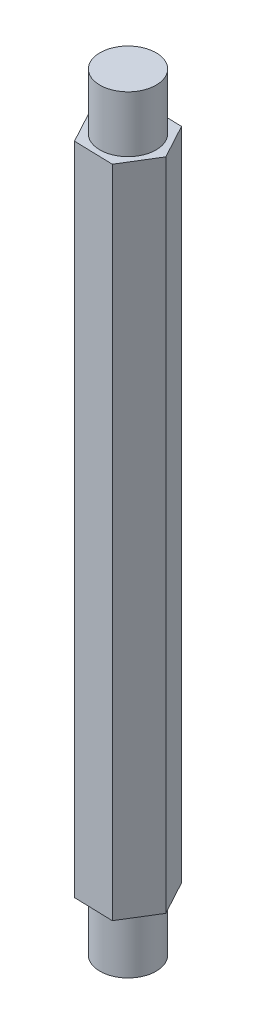
ISO-10303-21;
HEADER;
FILE_DESCRIPTION(('STEP AP214'),'2;1');
FILE_NAME('part.step','',(''),(''),'','','');
FILE_SCHEMA(('AUTOMOTIVE_DESIGN { 1 0 10303 214 1 1 1 1 }'));
ENDSEC;
DATA;
#1=APPLICATION_CONTEXT('core data for automotive mechanical design processes');
#2=APPLICATION_PROTOCOL_DEFINITION('international standard','automotive_design',2000,#1);
#3=PRODUCT_CONTEXT('',#1,'mechanical');
#4=PRODUCT('Part','Part','',(#3));
#5=PRODUCT_RELATED_PRODUCT_CATEGORY('part','',(#4));
#6=PRODUCT_DEFINITION_FORMATION('','',#4);
#7=PRODUCT_DEFINITION_CONTEXT('part definition',#1,'design');
#8=PRODUCT_DEFINITION('design','',#6,#7);
#9=PRODUCT_DEFINITION_SHAPE('','',#8);
#10=(LENGTH_UNIT() NAMED_UNIT(*) SI_UNIT(.MILLI.,.METRE.));
#11=(NAMED_UNIT(*) PLANE_ANGLE_UNIT() SI_UNIT($,.RADIAN.));
#12=(NAMED_UNIT(*) SI_UNIT($,.STERADIAN.) SOLID_ANGLE_UNIT());
#13=UNCERTAINTY_MEASURE_WITH_UNIT(LENGTH_MEASURE(1.E-05),#10,'distance_accuracy_value','');
#14=(GEOMETRIC_REPRESENTATION_CONTEXT(3) GLOBAL_UNCERTAINTY_ASSIGNED_CONTEXT((#13)) GLOBAL_UNIT_ASSIGNED_CONTEXT((#10,
#11,#12)) REPRESENTATION_CONTEXT('',''));
#15=CARTESIAN_POINT('',(0.,0.,0.));
#16=DIRECTION('',(0.,0.,1.));
#17=DIRECTION('',(1.,0.,0.));
#18=AXIS2_PLACEMENT_3D('',#15,#16,#17);
#19=CARTESIAN_POINT('',(0.,38.,0.));
#20=DIRECTION('',(0.,1.,0.));
#21=DIRECTION('',(0.,0.,1.));
#22=AXIS2_PLACEMENT_3D('',#19,#20,#21);
#23=PLANE('',#22);
#24=DIRECTION('',(-0.999619051100166,0.,-0.0275998673475779));
#25=VECTOR('',#24,1.);
#26=CARTESIAN_POINT('',(1.08851435205721,38.,-1.7706316684634));
#27=LINE('',#26,#25);
#28=CARTESIAN_POINT('',(1.08851435205721,38.,-1.7706316684634));
#29=VERTEX_POINT('',#28);
#30=CARTESIAN_POINT('',(-0.989154829605925,38.,-1.8279969154972));
#31=VERTEX_POINT('',#30);
#32=EDGE_CURVE('E132',#29,#31,#27,.T.);
#33=ORIENTED_EDGE('',*,*,#32,.T.);
#34=DIRECTION('',(-0.523711711814166,0.,0.85189555868585));
#35=VECTOR('',#34,1.);
#36=CARTESIAN_POINT('',(-0.989154829605925,38.,-1.8279969154972));
#37=LINE('',#36,#35);
#38=CARTESIAN_POINT('',(-2.07766918166313,38.,-0.0573652470337996));
#39=VERTEX_POINT('',#38);
#40=EDGE_CURVE('E90',#31,#39,#37,.T.);
#41=ORIENTED_EDGE('',*,*,#40,.T.);
#42=DIRECTION('',(0.475907339286,0.,0.879495426033427));
#43=VECTOR('',#42,1.);
#44=CARTESIAN_POINT('',(-2.07766918166313,38.,-0.0573652470337996));
#45=LINE('',#44,#43);
#46=CARTESIAN_POINT('',(-1.0885143520572,38.,1.7706316684634));
#47=VERTEX_POINT('',#46);
#48=EDGE_CURVE('E103',#39,#47,#45,.T.);
#49=ORIENTED_EDGE('',*,*,#48,.T.);
#50=DIRECTION('',(0.999619051100166,0.,0.0275998673475778));
#51=VECTOR('',#50,1.);
#52=CARTESIAN_POINT('',(-1.0885143520572,38.,1.7706316684634));
#53=LINE('',#52,#51);
#54=CARTESIAN_POINT('',(0.989154829605927,38.,1.8279969154972));
#55=VERTEX_POINT('',#54);
#56=EDGE_CURVE('E97',#47,#55,#53,.T.);
#57=ORIENTED_EDGE('',*,*,#56,.T.);
#58=DIRECTION('',(0.523711711814166,0.,-0.85189555868585));
#59=VECTOR('',#58,1.);
#60=CARTESIAN_POINT('',(0.989154829605927,38.,1.8279969154972));
#61=LINE('',#60,#59);
#62=CARTESIAN_POINT('',(2.07766918166313,38.,0.0573652470337994));
#63=VERTEX_POINT('',#62);
#64=EDGE_CURVE('E101',#55,#63,#61,.T.);
#65=ORIENTED_EDGE('',*,*,#64,.T.);
#66=DIRECTION('',(-0.475907339286,0.,-0.879495426033427));
#67=VECTOR('',#66,1.);
#68=CARTESIAN_POINT('',(2.07766918166313,38.,0.0573652470337994));
#69=LINE('',#68,#67);
#70=EDGE_CURVE('E52',#63,#29,#69,.T.);
#71=ORIENTED_EDGE('',*,*,#70,.T.);
#72=EDGE_LOOP('',(#33,#41,#49,#57,#65,#71));
#73=FACE_BOUND('',#72,.T.);
#74=CARTESIAN_POINT('',(0.,38.,0.));
#75=DIRECTION('',(0.,1.,0.));
#76=DIRECTION('',(0.,0.,1.));
#77=AXIS2_PLACEMENT_3D('',#74,#75,#76);
#78=CIRCLE('',#77,1.5);
#79=CARTESIAN_POINT('',(0.,38.,1.5));
#80=VERTEX_POINT('',#79);
#81=EDGE_CURVE('E189',#80,#80,#78,.T.);
#82=ORIENTED_EDGE('',*,*,#81,.F.);
#83=EDGE_LOOP('',(#82));
#84=FACE_BOUND('',#83,.T.);
#85=ADVANCED_FACE('F35',(#73,#84),#23,.T.);
#86=CARTESIAN_POINT('',(0.,3.,0.));
#87=DIRECTION('',(0.,-1.,0.));
#88=DIRECTION('',(0.,0.,-1.));
#89=AXIS2_PLACEMENT_3D('',#86,#87,#88);
#90=CYLINDRICAL_SURFACE('',#89,1.5);
#91=CARTESIAN_POINT('',(0.,3.,0.));
#92=DIRECTION('',(0.,1.,0.));
#93=DIRECTION('',(0.,0.,1.));
#94=AXIS2_PLACEMENT_3D('',#91,#92,#93);
#95=CIRCLE('',#94,1.5);
#96=CARTESIAN_POINT('',(0.,3.,1.5));
#97=VERTEX_POINT('',#96);
#98=EDGE_CURVE('E11',#97,#97,#95,.T.);
#99=ORIENTED_EDGE('',*,*,#98,.F.);
#100=EDGE_LOOP('',(#99));
#101=FACE_BOUND('',#100,.T.);
#102=CARTESIAN_POINT('',(0.,0.,0.));
#103=DIRECTION('',(0.,1.,0.));
#104=DIRECTION('',(0.,0.,1.));
#105=AXIS2_PLACEMENT_3D('',#102,#103,#104);
#106=CIRCLE('',#105,1.5);
#107=CARTESIAN_POINT('',(0.,0.,1.5));
#108=VERTEX_POINT('',#107);
#109=EDGE_CURVE('E39',#108,#108,#106,.T.);
#110=ORIENTED_EDGE('',*,*,#109,.T.);
#111=EDGE_LOOP('',(#110));
#112=FACE_BOUND('',#111,.T.);
#113=ADVANCED_FACE('F37',(#101,#112),#90,.T.);
#114=CARTESIAN_POINT('',(0.,0.,0.));
#115=DIRECTION('',(0.,1.,0.));
#116=DIRECTION('',(0.,0.,1.));
#117=AXIS2_PLACEMENT_3D('',#114,#115,#116);
#118=PLANE('',#117);
#119=ORIENTED_EDGE('',*,*,#109,.F.);
#120=EDGE_LOOP('',(#119));
#121=FACE_BOUND('',#120,.T.);
#122=ADVANCED_FACE('F145',(#121),#118,.F.);
#123=CARTESIAN_POINT('',(0.,3.,0.));
#124=DIRECTION('',(0.,1.,0.));
#125=DIRECTION('',(0.,0.,1.));
#126=AXIS2_PLACEMENT_3D('',#123,#124,#125);
#127=PLANE('',#126);
#128=DIRECTION('',(-0.999619051100166,0.,-0.0275998673475779));
#129=VECTOR('',#128,1.);
#130=CARTESIAN_POINT('',(1.08851435205721,3.,-1.7706316684634));
#131=LINE('',#130,#129);
#132=CARTESIAN_POINT('',(1.08851435205721,3.,-1.7706316684634));
#133=VERTEX_POINT('',#132);
#134=CARTESIAN_POINT('',(-0.989154829605925,3.,-1.8279969154972));
#135=VERTEX_POINT('',#134);
#136=EDGE_CURVE('E121',#133,#135,#131,.T.);
#137=ORIENTED_EDGE('',*,*,#136,.F.);
#138=DIRECTION('',(-0.475907339286,0.,-0.879495426033427));
#139=VECTOR('',#138,1.);
#140=CARTESIAN_POINT('',(2.07766918166313,3.,0.0573652470337994));
#141=LINE('',#140,#139);
#142=CARTESIAN_POINT('',(2.07766918166313,3.,0.0573652470337994));
#143=VERTEX_POINT('',#142);
#144=EDGE_CURVE('E81',#143,#133,#141,.T.);
#145=ORIENTED_EDGE('',*,*,#144,.F.);
#146=DIRECTION('',(0.523711711814166,0.,-0.85189555868585));
#147=VECTOR('',#146,1.);
#148=CARTESIAN_POINT('',(0.989154829605927,3.,1.8279969154972));
#149=LINE('',#148,#147);
#150=CARTESIAN_POINT('',(0.989154829605927,3.,1.8279969154972));
#151=VERTEX_POINT('',#150);
#152=EDGE_CURVE('E75',#151,#143,#149,.T.);
#153=ORIENTED_EDGE('',*,*,#152,.F.);
#154=DIRECTION('',(0.999619051100166,0.,0.0275998673475778));
#155=VECTOR('',#154,1.);
#156=CARTESIAN_POINT('',(-1.0885143520572,3.,1.7706316684634));
#157=LINE('',#156,#155);
#158=CARTESIAN_POINT('',(-1.0885143520572,3.,1.7706316684634));
#159=VERTEX_POINT('',#158);
#160=EDGE_CURVE('E111',#159,#151,#157,.T.);
#161=ORIENTED_EDGE('',*,*,#160,.F.);
#162=DIRECTION('',(0.475907339286,0.,0.879495426033427));
#163=VECTOR('',#162,1.);
#164=CARTESIAN_POINT('',(-2.07766918166313,3.,-0.0573652470337996));
#165=LINE('',#164,#163);
#166=CARTESIAN_POINT('',(-2.07766918166313,3.,-0.0573652470337996));
#167=VERTEX_POINT('',#166);
#168=EDGE_CURVE('E127',#167,#159,#165,.T.);
#169=ORIENTED_EDGE('',*,*,#168,.F.);
#170=DIRECTION('',(-0.523711711814166,0.,0.85189555868585));
#171=VECTOR('',#170,1.);
#172=CARTESIAN_POINT('',(-0.989154829605925,3.,-1.8279969154972));
#173=LINE('',#172,#171);
#174=EDGE_CURVE('E124',#135,#167,#173,.T.);
#175=ORIENTED_EDGE('',*,*,#174,.F.);
#176=EDGE_LOOP('',(#137,#145,#153,#161,#169,#175));
#177=FACE_BOUND('',#176,.T.);
#178=ORIENTED_EDGE('',*,*,#98,.T.);
#179=EDGE_LOOP('',(#178));
#180=FACE_BOUND('',#179,.T.);
#181=ADVANCED_FACE('F147',(#177,#180),#127,.F.);
#182=CARTESIAN_POINT('',(1.08851435205721,38.,-1.7706316684634));
#183=DIRECTION('',(-0.0275998673475779,0.,0.999619051100166));
#184=DIRECTION('',(0.999619051100166,0.,0.0275998673475779));
#185=AXIS2_PLACEMENT_3D('',#182,#183,#184);
#186=PLANE('',#185);
#187=ORIENTED_EDGE('',*,*,#136,.T.);
#188=DIRECTION('',(0.,-1.,0.));
#189=VECTOR('',#188,1.);
#190=CARTESIAN_POINT('',(-0.989154829605925,38.,-1.8279969154972));
#191=LINE('',#190,#189);
#192=EDGE_CURVE('E139',#31,#135,#191,.T.);
#193=ORIENTED_EDGE('',*,*,#192,.F.);
#194=ORIENTED_EDGE('',*,*,#32,.F.);
#195=DIRECTION('',(0.,-1.,0.));
#196=VECTOR('',#195,1.);
#197=CARTESIAN_POINT('',(1.08851435205721,38.,-1.7706316684634));
#198=LINE('',#197,#196);
#199=EDGE_CURVE('E117',#29,#133,#198,.T.);
#200=ORIENTED_EDGE('',*,*,#199,.T.);
#201=EDGE_LOOP('',(#187,#193,#194,#200));
#202=FACE_BOUND('',#201,.T.);
#203=ADVANCED_FACE('F152',(#202),#186,.F.);
#204=CARTESIAN_POINT('',(-0.989154829605925,38.,-1.8279969154972));
#205=DIRECTION('',(0.85189555868585,0.,0.523711711814166));
#206=DIRECTION('',(0.523711711814166,0.,-0.85189555868585));
#207=AXIS2_PLACEMENT_3D('',#204,#205,#206);
#208=PLANE('',#207);
#209=ORIENTED_EDGE('',*,*,#174,.T.);
#210=DIRECTION('',(0.,-1.,0.));
#211=VECTOR('',#210,1.);
#212=CARTESIAN_POINT('',(-2.07766918166313,38.,-0.0573652470337996));
#213=LINE('',#212,#211);
#214=EDGE_CURVE('E136',#39,#167,#213,.T.);
#215=ORIENTED_EDGE('',*,*,#214,.F.);
#216=ORIENTED_EDGE('',*,*,#40,.F.);
#217=ORIENTED_EDGE('',*,*,#192,.T.);
#218=EDGE_LOOP('',(#209,#215,#216,#217));
#219=FACE_BOUND('',#218,.T.);
#220=ADVANCED_FACE('F175',(#219),#208,.F.);
#221=CARTESIAN_POINT('',(-2.07766918166313,38.,-0.0573652470337996));
#222=DIRECTION('',(0.879495426033427,0.,-0.475907339286));
#223=DIRECTION('',(-0.475907339286,0.,-0.879495426033427));
#224=AXIS2_PLACEMENT_3D('',#221,#222,#223);
#225=PLANE('',#224);
#226=ORIENTED_EDGE('',*,*,#168,.T.);
#227=DIRECTION('',(0.,-1.,0.));
#228=VECTOR('',#227,1.);
#229=CARTESIAN_POINT('',(-1.0885143520572,38.,1.7706316684634));
#230=LINE('',#229,#228);
#231=EDGE_CURVE('E112',#47,#159,#230,.T.);
#232=ORIENTED_EDGE('',*,*,#231,.F.);
#233=ORIENTED_EDGE('',*,*,#48,.F.);
#234=ORIENTED_EDGE('',*,*,#214,.T.);
#235=EDGE_LOOP('',(#226,#232,#233,#234));
#236=FACE_BOUND('',#235,.T.);
#237=ADVANCED_FACE('F172',(#236),#225,.F.);
#238=CARTESIAN_POINT('',(-1.0885143520572,38.,1.7706316684634));
#239=DIRECTION('',(0.0275998673475778,0.,-0.999619051100166));
#240=DIRECTION('',(-0.999619051100166,0.,-0.0275998673475778));
#241=AXIS2_PLACEMENT_3D('',#238,#239,#240);
#242=PLANE('',#241);
#243=ORIENTED_EDGE('',*,*,#160,.T.);
#244=DIRECTION('',(0.,-1.,0.));
#245=VECTOR('',#244,1.);
#246=CARTESIAN_POINT('',(0.989154829605927,38.,1.8279969154972));
#247=LINE('',#246,#245);
#248=EDGE_CURVE('E108',#55,#151,#247,.T.);
#249=ORIENTED_EDGE('',*,*,#248,.F.);
#250=ORIENTED_EDGE('',*,*,#56,.F.);
#251=ORIENTED_EDGE('',*,*,#231,.T.);
#252=EDGE_LOOP('',(#243,#249,#250,#251));
#253=FACE_BOUND('',#252,.T.);
#254=ADVANCED_FACE('F109',(#253),#242,.F.);
#255=CARTESIAN_POINT('',(0.989154829605927,38.,1.8279969154972));
#256=DIRECTION('',(-0.85189555868585,0.,-0.523711711814166));
#257=DIRECTION('',(-0.523711711814166,0.,0.85189555868585));
#258=AXIS2_PLACEMENT_3D('',#255,#256,#257);
#259=PLANE('',#258);
#260=ORIENTED_EDGE('',*,*,#152,.T.);
#261=DIRECTION('',(0.,-1.,0.));
#262=VECTOR('',#261,1.);
#263=CARTESIAN_POINT('',(2.07766918166313,38.,0.0573652470337994));
#264=LINE('',#263,#262);
#265=EDGE_CURVE('E113',#63,#143,#264,.T.);
#266=ORIENTED_EDGE('',*,*,#265,.F.);
#267=ORIENTED_EDGE('',*,*,#64,.F.);
#268=ORIENTED_EDGE('',*,*,#248,.T.);
#269=EDGE_LOOP('',(#260,#266,#267,#268));
#270=FACE_BOUND('',#269,.T.);
#271=ADVANCED_FACE('F115',(#270),#259,.F.);
#272=CARTESIAN_POINT('',(2.07766918166313,38.,0.0573652470337994));
#273=DIRECTION('',(-0.879495426033428,0.,0.475907339286));
#274=DIRECTION('',(0.475907339286,0.,0.879495426033428));
#275=AXIS2_PLACEMENT_3D('',#272,#273,#274);
#276=PLANE('',#275);
#277=ORIENTED_EDGE('',*,*,#144,.T.);
#278=ORIENTED_EDGE('',*,*,#199,.F.);
#279=ORIENTED_EDGE('',*,*,#70,.F.);
#280=ORIENTED_EDGE('',*,*,#265,.T.);
#281=EDGE_LOOP('',(#277,#278,#279,#280));
#282=FACE_BOUND('',#281,.T.);
#283=ADVANCED_FACE('F165',(#282),#276,.F.);
#284=CARTESIAN_POINT('',(0.,41.,0.));
#285=DIRECTION('',(0.,-1.,0.));
#286=DIRECTION('',(0.,0.,-1.));
#287=AXIS2_PLACEMENT_3D('',#284,#285,#286);
#288=CYLINDRICAL_SURFACE('',#287,1.5);
#289=CARTESIAN_POINT('',(0.,41.,0.));
#290=DIRECTION('',(0.,1.,0.));
#291=DIRECTION('',(0.,0.,1.));
#292=AXIS2_PLACEMENT_3D('',#289,#290,#291);
#293=CIRCLE('',#292,1.5);
#294=CARTESIAN_POINT('',(0.,41.,1.5));
#295=VERTEX_POINT('',#294);
#296=EDGE_CURVE('E125',#295,#295,#293,.T.);
#297=ORIENTED_EDGE('',*,*,#296,.F.);
#298=EDGE_LOOP('',(#297));
#299=FACE_BOUND('',#298,.T.);
#300=ORIENTED_EDGE('',*,*,#81,.T.);
#301=EDGE_LOOP('',(#300));
#302=FACE_BOUND('',#301,.T.);
#303=ADVANCED_FACE('F162',(#299,#302),#288,.T.);
#304=CARTESIAN_POINT('',(0.,41.,0.));
#305=DIRECTION('',(0.,1.,0.));
#306=DIRECTION('',(0.,0.,1.));
#307=AXIS2_PLACEMENT_3D('',#304,#305,#306);
#308=PLANE('',#307);
#309=ORIENTED_EDGE('',*,*,#296,.T.);
#310=EDGE_LOOP('',(#309));
#311=FACE_BOUND('',#310,.T.);
#312=ADVANCED_FACE('F195',(#311),#308,.T.);
#313=CLOSED_SHELL('',(#85,#113,#122,#181,#203,#220,#237,#254,#271,#283,#303,#312));
#314=MANIFOLD_SOLID_BREP('B2',#313);
#315=ADVANCED_BREP_SHAPE_REPRESENTATION('',(#18,#314),#14);
#316=SHAPE_DEFINITION_REPRESENTATION(#9,#315);
ENDSEC;
END-ISO-10303-21;
